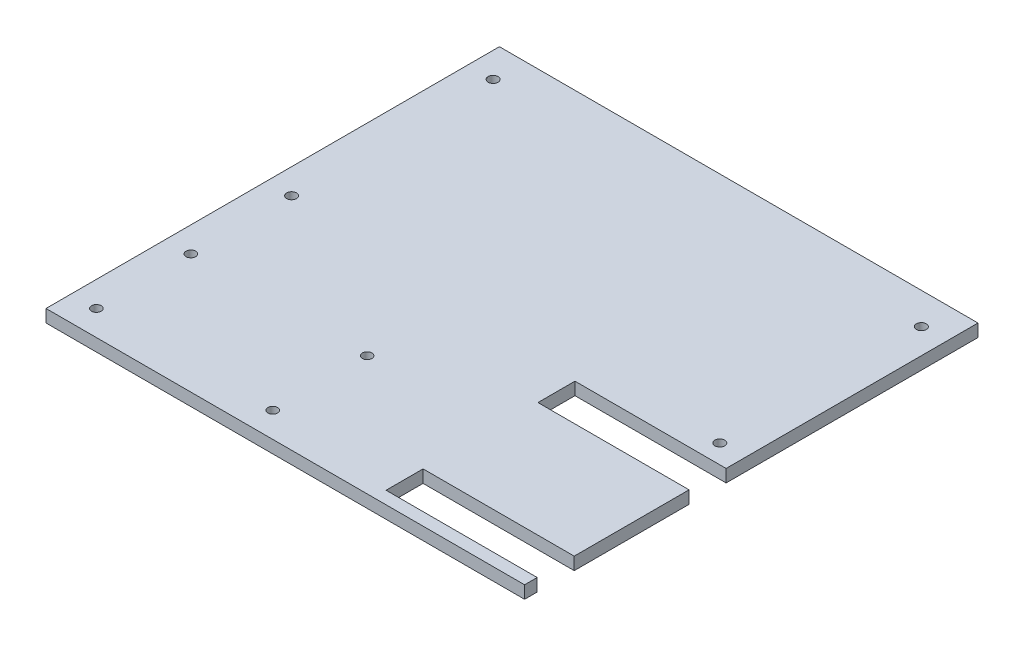
ISO-10303-21;
HEADER;
FILE_DESCRIPTION(('STEP AP214'),'2;1');
FILE_NAME('part.step','',(''),(''),'','','');
FILE_SCHEMA(('AUTOMOTIVE_DESIGN { 1 0 10303 214 1 1 1 1 }'));
ENDSEC;
DATA;
#1=APPLICATION_CONTEXT('core data for automotive mechanical design processes');
#2=APPLICATION_PROTOCOL_DEFINITION('international standard','automotive_design',2000,#1);
#3=PRODUCT_CONTEXT('',#1,'mechanical');
#4=PRODUCT('Part','Part','',(#3));
#5=PRODUCT_RELATED_PRODUCT_CATEGORY('part','',(#4));
#6=PRODUCT_DEFINITION_FORMATION('','',#4);
#7=PRODUCT_DEFINITION_CONTEXT('part definition',#1,'design');
#8=PRODUCT_DEFINITION('design','',#6,#7);
#9=PRODUCT_DEFINITION_SHAPE('','',#8);
#10=(LENGTH_UNIT() NAMED_UNIT(*) SI_UNIT(.MILLI.,.METRE.));
#11=(NAMED_UNIT(*) PLANE_ANGLE_UNIT() SI_UNIT($,.RADIAN.));
#12=(NAMED_UNIT(*) SI_UNIT($,.STERADIAN.) SOLID_ANGLE_UNIT());
#13=UNCERTAINTY_MEASURE_WITH_UNIT(LENGTH_MEASURE(1.E-05),#10,'distance_accuracy_value','');
#14=(GEOMETRIC_REPRESENTATION_CONTEXT(3) GLOBAL_UNCERTAINTY_ASSIGNED_CONTEXT((#13)) GLOBAL_UNIT_ASSIGNED_CONTEXT((#10,
#11,#12)) REPRESENTATION_CONTEXT('',''));
#15=CARTESIAN_POINT('',(0.,0.,0.));
#16=DIRECTION('',(0.,0.,1.));
#17=DIRECTION('',(1.,0.,0.));
#18=AXIS2_PLACEMENT_3D('',#15,#16,#17);
#19=CARTESIAN_POINT('',(0.,6.35,107.95));
#20=DIRECTION('',(0.,0.,-1.));
#21=DIRECTION('',(-1.,0.,0.));
#22=AXIS2_PLACEMENT_3D('',#19,#20,#21);
#23=PLANE('',#22);
#24=DIRECTION('',(1.,0.,0.));
#25=VECTOR('',#24,1.);
#26=CARTESIAN_POINT('',(0.,0.,107.95));
#27=LINE('',#26,#25);
#28=CARTESIAN_POINT('',(44.45,0.,107.95));
#29=VERTEX_POINT('',#28);
#30=CARTESIAN_POINT('',(120.65,0.,107.95));
#31=VERTEX_POINT('',#30);
#32=EDGE_CURVE('E206',#29,#31,#27,.T.);
#33=ORIENTED_EDGE('',*,*,#32,.F.);
#34=DIRECTION('',(0.,-1.,0.));
#35=VECTOR('',#34,1.);
#36=CARTESIAN_POINT('',(44.45,6.35,107.95));
#37=LINE('',#36,#35);
#38=CARTESIAN_POINT('',(44.45,6.35,107.95));
#39=VERTEX_POINT('',#38);
#40=EDGE_CURVE('E11',#39,#29,#37,.T.);
#41=ORIENTED_EDGE('',*,*,#40,.F.);
#42=DIRECTION('',(1.,0.,0.));
#43=VECTOR('',#42,1.);
#44=CARTESIAN_POINT('',(0.,6.35,107.95));
#45=LINE('',#44,#43);
#46=CARTESIAN_POINT('',(120.65,6.35,107.95));
#47=VERTEX_POINT('',#46);
#48=EDGE_CURVE('E257',#39,#47,#45,.T.);
#49=ORIENTED_EDGE('',*,*,#48,.T.);
#50=DIRECTION('',(0.,-1.,0.));
#51=VECTOR('',#50,1.);
#52=CARTESIAN_POINT('',(120.65,6.35,107.95));
#53=LINE('',#52,#51);
#54=EDGE_CURVE('E57',#47,#31,#53,.T.);
#55=ORIENTED_EDGE('',*,*,#54,.T.);
#56=EDGE_LOOP('',(#33,#41,#49,#55));
#57=FACE_BOUND('',#56,.T.);
#58=ADVANCED_FACE('F39',(#57),#23,.T.);
#59=CARTESIAN_POINT('',(44.4499999999999,6.35,0.));
#60=DIRECTION('',(1.,0.,0.));
#61=DIRECTION('',(0.,0.,-1.));
#62=AXIS2_PLACEMENT_3D('',#59,#60,#61);
#63=PLANE('',#62);
#64=DIRECTION('',(0.,0.,1.));
#65=VECTOR('',#64,1.);
#66=CARTESIAN_POINT('',(44.4499999999999,0.,0.));
#67=LINE('',#66,#65);
#68=CARTESIAN_POINT('',(44.45,0.,89.281));
#69=VERTEX_POINT('',#68);
#70=EDGE_CURVE('E198',#69,#29,#67,.T.);
#71=ORIENTED_EDGE('',*,*,#70,.F.);
#72=DIRECTION('',(0.,-1.,0.));
#73=VECTOR('',#72,1.);
#74=CARTESIAN_POINT('',(44.45,6.35,89.281));
#75=LINE('',#74,#73);
#76=CARTESIAN_POINT('',(44.45,6.35,89.281));
#77=VERTEX_POINT('',#76);
#78=EDGE_CURVE('E49',#77,#69,#75,.T.);
#79=ORIENTED_EDGE('',*,*,#78,.F.);
#80=DIRECTION('',(0.,0.,1.));
#81=VECTOR('',#80,1.);
#82=CARTESIAN_POINT('',(44.4499999999999,6.35,0.));
#83=LINE('',#82,#81);
#84=EDGE_CURVE('E255',#77,#39,#83,.T.);
#85=ORIENTED_EDGE('',*,*,#84,.T.);
#86=ORIENTED_EDGE('',*,*,#40,.T.);
#87=EDGE_LOOP('',(#71,#79,#85,#86));
#88=FACE_BOUND('',#87,.T.);
#89=ADVANCED_FACE('F204',(#88),#63,.T.);
#90=CARTESIAN_POINT('',(0.,6.35,89.281));
#91=DIRECTION('',(0.,0.,-1.));
#92=DIRECTION('',(-1.,0.,0.));
#93=AXIS2_PLACEMENT_3D('',#90,#91,#92);
#94=PLANE('',#93);
#95=DIRECTION('',(1.,0.,0.));
#96=VECTOR('',#95,1.);
#97=CARTESIAN_POINT('',(0.,0.,89.281));
#98=LINE('',#97,#96);
#99=CARTESIAN_POINT('',(120.65,0.,89.281));
#100=VERTEX_POINT('',#99);
#101=EDGE_CURVE('E188',#69,#100,#98,.T.);
#102=ORIENTED_EDGE('',*,*,#101,.T.);
#103=DIRECTION('',(0.,-1.,0.));
#104=VECTOR('',#103,1.);
#105=CARTESIAN_POINT('',(120.65,6.35,89.281));
#106=LINE('',#105,#104);
#107=CARTESIAN_POINT('',(120.65,6.35,89.281));
#108=VERTEX_POINT('',#107);
#109=EDGE_CURVE('E179',#108,#100,#106,.T.);
#110=ORIENTED_EDGE('',*,*,#109,.F.);
#111=DIRECTION('',(1.,0.,0.));
#112=VECTOR('',#111,1.);
#113=CARTESIAN_POINT('',(0.,6.35,89.281));
#114=LINE('',#113,#112);
#115=EDGE_CURVE('E190',#77,#108,#114,.T.);
#116=ORIENTED_EDGE('',*,*,#115,.F.);
#117=ORIENTED_EDGE('',*,*,#78,.T.);
#118=EDGE_LOOP('',(#102,#110,#116,#117));
#119=FACE_BOUND('',#118,.T.);
#120=ADVANCED_FACE('F186',(#119),#94,.F.);
#121=CARTESIAN_POINT('',(120.65,6.35,0.));
#122=DIRECTION('',(1.,0.,0.));
#123=DIRECTION('',(0.,0.,-1.));
#124=AXIS2_PLACEMENT_3D('',#121,#122,#123);
#125=PLANE('',#124);
#126=DIRECTION('',(0.,0.,1.));
#127=VECTOR('',#126,1.);
#128=CARTESIAN_POINT('',(120.65,0.,0.));
#129=LINE('',#128,#127);
#130=CARTESIAN_POINT('',(120.65,0.,31.369));
#131=VERTEX_POINT('',#130);
#132=EDGE_CURVE('E201',#131,#100,#129,.T.);
#133=ORIENTED_EDGE('',*,*,#132,.F.);
#134=DIRECTION('',(0.,-1.,0.));
#135=VECTOR('',#134,1.);
#136=CARTESIAN_POINT('',(120.65,6.35,31.369));
#137=LINE('',#136,#135);
#138=CARTESIAN_POINT('',(120.65,6.35,31.369));
#139=VERTEX_POINT('',#138);
#140=EDGE_CURVE('E176',#139,#131,#137,.T.);
#141=ORIENTED_EDGE('',*,*,#140,.F.);
#142=DIRECTION('',(0.,0.,1.));
#143=VECTOR('',#142,1.);
#144=CARTESIAN_POINT('',(120.65,6.35,0.));
#145=LINE('',#144,#143);
#146=EDGE_CURVE('E240',#139,#108,#145,.T.);
#147=ORIENTED_EDGE('',*,*,#146,.T.);
#148=ORIENTED_EDGE('',*,*,#109,.T.);
#149=EDGE_LOOP('',(#133,#141,#147,#148));
#150=FACE_BOUND('',#149,.T.);
#151=ADVANCED_FACE('F317',(#150),#125,.T.);
#152=CARTESIAN_POINT('',(0.,6.35,31.369));
#153=DIRECTION('',(0.,0.,-1.));
#154=DIRECTION('',(-1.,0.,0.));
#155=AXIS2_PLACEMENT_3D('',#152,#153,#154);
#156=PLANE('',#155);
#157=DIRECTION('',(1.,0.,0.));
#158=VECTOR('',#157,1.);
#159=CARTESIAN_POINT('',(0.,0.,31.369));
#160=LINE('',#159,#158);
#161=CARTESIAN_POINT('',(44.45,0.,31.369));
#162=VERTEX_POINT('',#161);
#163=EDGE_CURVE('E215',#162,#131,#160,.T.);
#164=ORIENTED_EDGE('',*,*,#163,.F.);
#165=DIRECTION('',(0.,-1.,0.));
#166=VECTOR('',#165,1.);
#167=CARTESIAN_POINT('',(44.45,6.35,31.369));
#168=LINE('',#167,#166);
#169=CARTESIAN_POINT('',(44.45,6.35,31.369));
#170=VERTEX_POINT('',#169);
#171=EDGE_CURVE('E173',#170,#162,#168,.T.);
#172=ORIENTED_EDGE('',*,*,#171,.F.);
#173=DIRECTION('',(1.,0.,0.));
#174=VECTOR('',#173,1.);
#175=CARTESIAN_POINT('',(0.,6.35,31.369));
#176=LINE('',#175,#174);
#177=EDGE_CURVE('E248',#170,#139,#176,.T.);
#178=ORIENTED_EDGE('',*,*,#177,.T.);
#179=ORIENTED_EDGE('',*,*,#140,.T.);
#180=EDGE_LOOP('',(#164,#172,#178,#179));
#181=FACE_BOUND('',#180,.T.);
#182=ADVANCED_FACE('F315',(#181),#156,.T.);
#183=CARTESIAN_POINT('',(44.45,6.35,0.));
#184=DIRECTION('',(1.,0.,0.));
#185=DIRECTION('',(0.,0.,-1.));
#186=AXIS2_PLACEMENT_3D('',#183,#184,#185);
#187=PLANE('',#186);
#188=DIRECTION('',(0.,0.,1.));
#189=VECTOR('',#188,1.);
#190=CARTESIAN_POINT('',(44.45,0.,0.));
#191=LINE('',#190,#189);
#192=CARTESIAN_POINT('',(44.45,0.,12.7));
#193=VERTEX_POINT('',#192);
#194=EDGE_CURVE('E220',#193,#162,#191,.T.);
#195=ORIENTED_EDGE('',*,*,#194,.F.);
#196=DIRECTION('',(0.,-1.,0.));
#197=VECTOR('',#196,1.);
#198=CARTESIAN_POINT('',(44.45,6.35,12.7));
#199=LINE('',#198,#197);
#200=CARTESIAN_POINT('',(44.45,6.35,12.7));
#201=VERTEX_POINT('',#200);
#202=EDGE_CURVE('E170',#201,#193,#199,.T.);
#203=ORIENTED_EDGE('',*,*,#202,.F.);
#204=DIRECTION('',(0.,0.,1.));
#205=VECTOR('',#204,1.);
#206=CARTESIAN_POINT('',(44.45,6.35,0.));
#207=LINE('',#206,#205);
#208=EDGE_CURVE('E254',#201,#170,#207,.T.);
#209=ORIENTED_EDGE('',*,*,#208,.T.);
#210=ORIENTED_EDGE('',*,*,#171,.T.);
#211=EDGE_LOOP('',(#195,#203,#209,#210));
#212=FACE_BOUND('',#211,.T.);
#213=ADVANCED_FACE('F312',(#212),#187,.T.);
#214=CARTESIAN_POINT('',(0.,6.35,12.7));
#215=DIRECTION('',(0.,0.,-1.));
#216=DIRECTION('',(-1.,0.,0.));
#217=AXIS2_PLACEMENT_3D('',#214,#215,#216);
#218=PLANE('',#217);
#219=DIRECTION('',(1.,0.,0.));
#220=VECTOR('',#219,1.);
#221=CARTESIAN_POINT('',(0.,0.,12.7));
#222=LINE('',#221,#220);
#223=CARTESIAN_POINT('',(120.65,0.,12.7));
#224=VERTEX_POINT('',#223);
#225=EDGE_CURVE('E224',#193,#224,#222,.T.);
#226=ORIENTED_EDGE('',*,*,#225,.T.);
#227=DIRECTION('',(0.,-1.,0.));
#228=VECTOR('',#227,1.);
#229=CARTESIAN_POINT('',(120.65,6.35,12.7));
#230=LINE('',#229,#228);
#231=CARTESIAN_POINT('',(120.65,6.35,12.7));
#232=VERTEX_POINT('',#231);
#233=EDGE_CURVE('E167',#232,#224,#230,.T.);
#234=ORIENTED_EDGE('',*,*,#233,.F.);
#235=DIRECTION('',(1.,0.,0.));
#236=VECTOR('',#235,1.);
#237=CARTESIAN_POINT('',(0.,6.35,12.7));
#238=LINE('',#237,#236);
#239=EDGE_CURVE('E245',#201,#232,#238,.T.);
#240=ORIENTED_EDGE('',*,*,#239,.F.);
#241=ORIENTED_EDGE('',*,*,#202,.T.);
#242=EDGE_LOOP('',(#226,#234,#240,#241));
#243=FACE_BOUND('',#242,.T.);
#244=ADVANCED_FACE('F308',(#243),#218,.F.);
#245=CARTESIAN_POINT('',(120.65,0.,-114.3));
#246=VERTEX_POINT('',#245);
#247=EDGE_CURVE('E217',#246,#224,#129,.T.);
#248=ORIENTED_EDGE('',*,*,#247,.F.);
#249=DIRECTION('',(0.,-1.,0.));
#250=VECTOR('',#249,1.);
#251=CARTESIAN_POINT('',(120.65,6.35,-114.3));
#252=LINE('',#251,#250);
#253=CARTESIAN_POINT('',(120.65,6.35,-114.3));
#254=VERTEX_POINT('',#253);
#255=EDGE_CURVE('E160',#254,#246,#252,.T.);
#256=ORIENTED_EDGE('',*,*,#255,.F.);
#257=EDGE_CURVE('E239',#254,#232,#145,.T.);
#258=ORIENTED_EDGE('',*,*,#257,.T.);
#259=ORIENTED_EDGE('',*,*,#233,.T.);
#260=EDGE_LOOP('',(#248,#256,#258,#259));
#261=FACE_BOUND('',#260,.T.);
#262=ADVANCED_FACE('F304',(#261),#125,.T.);
#263=CARTESIAN_POINT('',(0.,6.35,-114.3));
#264=DIRECTION('',(0.,0.,-1.));
#265=DIRECTION('',(-1.,0.,0.));
#266=AXIS2_PLACEMENT_3D('',#263,#264,#265);
#267=PLANE('',#266);
#268=DIRECTION('',(1.,0.,0.));
#269=VECTOR('',#268,1.);
#270=CARTESIAN_POINT('',(0.,0.,-114.3));
#271=LINE('',#270,#269);
#272=CARTESIAN_POINT('',(-120.65,0.,-114.3));
#273=VERTEX_POINT('',#272);
#274=EDGE_CURVE('E228',#273,#246,#271,.T.);
#275=ORIENTED_EDGE('',*,*,#274,.F.);
#276=DIRECTION('',(0.,-1.,0.));
#277=VECTOR('',#276,1.);
#278=CARTESIAN_POINT('',(-120.65,6.35,-114.3));
#279=LINE('',#278,#277);
#280=CARTESIAN_POINT('',(-120.65,6.35,-114.3));
#281=VERTEX_POINT('',#280);
#282=EDGE_CURVE('E156',#281,#273,#279,.T.);
#283=ORIENTED_EDGE('',*,*,#282,.F.);
#284=DIRECTION('',(1.,0.,0.));
#285=VECTOR('',#284,1.);
#286=CARTESIAN_POINT('',(0.,6.35,-114.3));
#287=LINE('',#286,#285);
#288=EDGE_CURVE('E148',#281,#254,#287,.T.);
#289=ORIENTED_EDGE('',*,*,#288,.T.);
#290=ORIENTED_EDGE('',*,*,#255,.T.);
#291=EDGE_LOOP('',(#275,#283,#289,#290));
#292=FACE_BOUND('',#291,.T.);
#293=ADVANCED_FACE('F330',(#292),#267,.T.);
#294=CARTESIAN_POINT('',(-120.65,6.35,0.));
#295=DIRECTION('',(1.,0.,0.));
#296=DIRECTION('',(0.,0.,-1.));
#297=AXIS2_PLACEMENT_3D('',#294,#295,#296);
#298=PLANE('',#297);
#299=DIRECTION('',(0.,0.,1.));
#300=VECTOR('',#299,1.);
#301=CARTESIAN_POINT('',(-120.65,0.,0.));
#302=LINE('',#301,#300);
#303=CARTESIAN_POINT('',(-120.65,0.,114.3));
#304=VERTEX_POINT('',#303);
#305=EDGE_CURVE('E154',#273,#304,#302,.T.);
#306=ORIENTED_EDGE('',*,*,#305,.T.);
#307=DIRECTION('',(0.,-1.,0.));
#308=VECTOR('',#307,1.);
#309=CARTESIAN_POINT('',(-120.65,6.35,114.3));
#310=LINE('',#309,#308);
#311=CARTESIAN_POINT('',(-120.65,6.35,114.3));
#312=VERTEX_POINT('',#311);
#313=EDGE_CURVE('E135',#312,#304,#310,.T.);
#314=ORIENTED_EDGE('',*,*,#313,.F.);
#315=DIRECTION('',(0.,0.,1.));
#316=VECTOR('',#315,1.);
#317=CARTESIAN_POINT('',(-120.65,6.35,0.));
#318=LINE('',#317,#316);
#319=EDGE_CURVE('E141',#281,#312,#318,.T.);
#320=ORIENTED_EDGE('',*,*,#319,.F.);
#321=ORIENTED_EDGE('',*,*,#282,.T.);
#322=EDGE_LOOP('',(#306,#314,#320,#321));
#323=FACE_BOUND('',#322,.T.);
#324=ADVANCED_FACE('F152',(#323),#298,.F.);
#325=CARTESIAN_POINT('',(0.,6.35,114.3));
#326=DIRECTION('',(0.,0.,-1.));
#327=DIRECTION('',(-1.,0.,0.));
#328=AXIS2_PLACEMENT_3D('',#325,#326,#327);
#329=PLANE('',#328);
#330=DIRECTION('',(1.,0.,0.));
#331=VECTOR('',#330,1.);
#332=CARTESIAN_POINT('',(0.,0.,114.3));
#333=LINE('',#332,#331);
#334=CARTESIAN_POINT('',(120.65,0.,114.3));
#335=VERTEX_POINT('',#334);
#336=EDGE_CURVE('E234',#304,#335,#333,.T.);
#337=ORIENTED_EDGE('',*,*,#336,.T.);
#338=DIRECTION('',(0.,-1.,0.));
#339=VECTOR('',#338,1.);
#340=CARTESIAN_POINT('',(120.65,6.35,114.3));
#341=LINE('',#340,#339);
#342=CARTESIAN_POINT('',(120.65,6.35,114.3));
#343=VERTEX_POINT('',#342);
#344=EDGE_CURVE('E95',#343,#335,#341,.T.);
#345=ORIENTED_EDGE('',*,*,#344,.F.);
#346=DIRECTION('',(1.,0.,0.));
#347=VECTOR('',#346,1.);
#348=CARTESIAN_POINT('',(0.,6.35,114.3));
#349=LINE('',#348,#347);
#350=EDGE_CURVE('E131',#312,#343,#349,.T.);
#351=ORIENTED_EDGE('',*,*,#350,.F.);
#352=ORIENTED_EDGE('',*,*,#313,.T.);
#353=EDGE_LOOP('',(#337,#345,#351,#352));
#354=FACE_BOUND('',#353,.T.);
#355=ADVANCED_FACE('F133',(#354),#329,.F.);
#356=CARTESIAN_POINT('',(-107.95,6.35,101.6));
#357=DIRECTION('',(0.,-1.,0.));
#358=DIRECTION('',(0.,0.,-1.));
#359=AXIS2_PLACEMENT_3D('',#356,#357,#358);
#360=CYLINDRICAL_SURFACE('',#359,2.4257);
#361=CARTESIAN_POINT('',(-107.95,6.35,101.6));
#362=DIRECTION('',(0.,1.,0.));
#363=DIRECTION('',(0.,0.,1.));
#364=AXIS2_PLACEMENT_3D('',#361,#362,#363);
#365=CIRCLE('',#364,2.4257);
#366=CARTESIAN_POINT('',(-107.95,6.35,104.0257));
#367=VERTEX_POINT('',#366);
#368=EDGE_CURVE('E262',#367,#367,#365,.T.);
#369=ORIENTED_EDGE('',*,*,#368,.T.);
#370=EDGE_LOOP('',(#369));
#371=FACE_BOUND('',#370,.T.);
#372=CARTESIAN_POINT('',(-107.95,0.,101.6));
#373=DIRECTION('',(0.,1.,0.));
#374=DIRECTION('',(0.,0.,1.));
#375=AXIS2_PLACEMENT_3D('',#372,#373,#374);
#376=CIRCLE('',#375,2.4257);
#377=CARTESIAN_POINT('',(-107.95,0.,104.0257));
#378=VERTEX_POINT('',#377);
#379=EDGE_CURVE('E209',#378,#378,#376,.T.);
#380=ORIENTED_EDGE('',*,*,#379,.F.);
#381=EDGE_LOOP('',(#380));
#382=FACE_BOUND('',#381,.T.);
#383=ADVANCED_FACE('F339',(#371,#382),#360,.F.);
#384=CARTESIAN_POINT('',(-107.95,6.35,53.975));
#385=DIRECTION('',(0.,-1.,0.));
#386=DIRECTION('',(0.,0.,-1.));
#387=AXIS2_PLACEMENT_3D('',#384,#385,#386);
#388=CYLINDRICAL_SURFACE('',#387,2.4257);
#389=CARTESIAN_POINT('',(-107.95,6.35,53.975));
#390=DIRECTION('',(0.,1.,0.));
#391=DIRECTION('',(0.,0.,1.));
#392=AXIS2_PLACEMENT_3D('',#389,#390,#391);
#393=CIRCLE('',#392,2.4257);
#394=CARTESIAN_POINT('',(-107.95,6.35,56.4007));
#395=VERTEX_POINT('',#394);
#396=EDGE_CURVE('E266',#395,#395,#393,.T.);
#397=ORIENTED_EDGE('',*,*,#396,.T.);
#398=EDGE_LOOP('',(#397));
#399=FACE_BOUND('',#398,.T.);
#400=CARTESIAN_POINT('',(-107.95,0.,53.975));
#401=DIRECTION('',(0.,1.,0.));
#402=DIRECTION('',(0.,0.,1.));
#403=AXIS2_PLACEMENT_3D('',#400,#401,#402);
#404=CIRCLE('',#403,2.4257);
#405=CARTESIAN_POINT('',(-107.95,0.,56.4007));
#406=VERTEX_POINT('',#405);
#407=EDGE_CURVE('E397',#406,#406,#404,.T.);
#408=ORIENTED_EDGE('',*,*,#407,.F.);
#409=EDGE_LOOP('',(#408));
#410=FACE_BOUND('',#409,.T.);
#411=ADVANCED_FACE('F342',(#399,#410),#388,.F.);
#412=CARTESIAN_POINT('',(-19.05,6.35,53.975));
#413=DIRECTION('',(0.,-1.,0.));
#414=DIRECTION('',(0.,0.,-1.));
#415=AXIS2_PLACEMENT_3D('',#412,#413,#414);
#416=CYLINDRICAL_SURFACE('',#415,2.4257);
#417=CARTESIAN_POINT('',(-19.05,6.35,53.975));
#418=DIRECTION('',(0.,1.,0.));
#419=DIRECTION('',(0.,0.,1.));
#420=AXIS2_PLACEMENT_3D('',#417,#418,#419);
#421=CIRCLE('',#420,2.4257);
#422=CARTESIAN_POINT('',(-19.05,6.35,56.4007));
#423=VERTEX_POINT('',#422);
#424=EDGE_CURVE('E270',#423,#423,#421,.T.);
#425=ORIENTED_EDGE('',*,*,#424,.T.);
#426=EDGE_LOOP('',(#425));
#427=FACE_BOUND('',#426,.T.);
#428=CARTESIAN_POINT('',(-19.05,0.,53.975));
#429=DIRECTION('',(0.,1.,0.));
#430=DIRECTION('',(0.,0.,1.));
#431=AXIS2_PLACEMENT_3D('',#428,#429,#430);
#432=CIRCLE('',#431,2.4257);
#433=CARTESIAN_POINT('',(-19.05,0.,56.4007));
#434=VERTEX_POINT('',#433);
#435=EDGE_CURVE('E393',#434,#434,#432,.T.);
#436=ORIENTED_EDGE('',*,*,#435,.F.);
#437=EDGE_LOOP('',(#436));
#438=FACE_BOUND('',#437,.T.);
#439=ADVANCED_FACE('F346',(#427,#438),#416,.F.);
#440=CARTESIAN_POINT('',(-19.05,6.35,101.6));
#441=DIRECTION('',(0.,-1.,0.));
#442=DIRECTION('',(0.,0.,-1.));
#443=AXIS2_PLACEMENT_3D('',#440,#441,#442);
#444=CYLINDRICAL_SURFACE('',#443,2.4257);
#445=CARTESIAN_POINT('',(-19.05,6.35,101.6));
#446=DIRECTION('',(0.,1.,0.));
#447=DIRECTION('',(0.,0.,1.));
#448=AXIS2_PLACEMENT_3D('',#445,#446,#447);
#449=CIRCLE('',#448,2.4257);
#450=CARTESIAN_POINT('',(-19.05,6.35,104.0257));
#451=VERTEX_POINT('',#450);
#452=EDGE_CURVE('E274',#451,#451,#449,.T.);
#453=ORIENTED_EDGE('',*,*,#452,.T.);
#454=EDGE_LOOP('',(#453));
#455=FACE_BOUND('',#454,.T.);
#456=CARTESIAN_POINT('',(-19.05,0.,101.6));
#457=DIRECTION('',(0.,1.,0.));
#458=DIRECTION('',(0.,0.,1.));
#459=AXIS2_PLACEMENT_3D('',#456,#457,#458);
#460=CIRCLE('',#459,2.4257);
#461=CARTESIAN_POINT('',(-19.05,0.,104.0257));
#462=VERTEX_POINT('',#461);
#463=EDGE_CURVE('E389',#462,#462,#460,.T.);
#464=ORIENTED_EDGE('',*,*,#463,.F.);
#465=EDGE_LOOP('',(#464));
#466=FACE_BOUND('',#465,.T.);
#467=ADVANCED_FACE('F350',(#455,#466),#444,.F.);
#468=CARTESIAN_POINT('',(-107.95,6.35,-98.425));
#469=DIRECTION('',(0.,-1.,0.));
#470=DIRECTION('',(0.,0.,-1.));
#471=AXIS2_PLACEMENT_3D('',#468,#469,#470);
#472=CYLINDRICAL_SURFACE('',#471,2.5019);
#473=CARTESIAN_POINT('',(-107.95,6.35,-98.425));
#474=DIRECTION('',(0.,1.,0.));
#475=DIRECTION('',(0.,0.,1.));
#476=AXIS2_PLACEMENT_3D('',#473,#474,#475);
#477=CIRCLE('',#476,2.5019);
#478=CARTESIAN_POINT('',(-107.95,6.35,-95.9231));
#479=VERTEX_POINT('',#478);
#480=EDGE_CURVE('E278',#479,#479,#477,.T.);
#481=ORIENTED_EDGE('',*,*,#480,.T.);
#482=EDGE_LOOP('',(#481));
#483=FACE_BOUND('',#482,.T.);
#484=CARTESIAN_POINT('',(-107.95,0.,-98.425));
#485=DIRECTION('',(0.,1.,0.));
#486=DIRECTION('',(0.,0.,1.));
#487=AXIS2_PLACEMENT_3D('',#484,#485,#486);
#488=CIRCLE('',#487,2.5019);
#489=CARTESIAN_POINT('',(-107.95,0.,-95.9231));
#490=VERTEX_POINT('',#489);
#491=EDGE_CURVE('E381',#490,#490,#488,.T.);
#492=ORIENTED_EDGE('',*,*,#491,.F.);
#493=EDGE_LOOP('',(#492));
#494=FACE_BOUND('',#493,.T.);
#495=ADVANCED_FACE('F354',(#483,#494),#472,.F.);
#496=CARTESIAN_POINT('',(-107.95,6.35,3.175));
#497=DIRECTION('',(0.,-1.,0.));
#498=DIRECTION('',(0.,0.,-1.));
#499=AXIS2_PLACEMENT_3D('',#496,#497,#498);
#500=CYLINDRICAL_SURFACE('',#499,2.5019);
#501=CARTESIAN_POINT('',(-107.95,6.35,3.175));
#502=DIRECTION('',(0.,1.,0.));
#503=DIRECTION('',(0.,0.,1.));
#504=AXIS2_PLACEMENT_3D('',#501,#502,#503);
#505=CIRCLE('',#504,2.5019);
#506=CARTESIAN_POINT('',(-107.95,6.35,5.6769));
#507=VERTEX_POINT('',#506);
#508=EDGE_CURVE('E282',#507,#507,#505,.T.);
#509=ORIENTED_EDGE('',*,*,#508,.T.);
#510=EDGE_LOOP('',(#509));
#511=FACE_BOUND('',#510,.T.);
#512=CARTESIAN_POINT('',(-107.95,0.,3.175));
#513=DIRECTION('',(0.,1.,0.));
#514=DIRECTION('',(0.,0.,1.));
#515=AXIS2_PLACEMENT_3D('',#512,#513,#514);
#516=CIRCLE('',#515,2.5019);
#517=CARTESIAN_POINT('',(-107.95,0.,5.6769));
#518=VERTEX_POINT('',#517);
#519=EDGE_CURVE('E375',#518,#518,#516,.T.);
#520=ORIENTED_EDGE('',*,*,#519,.F.);
#521=EDGE_LOOP('',(#520));
#522=FACE_BOUND('',#521,.T.);
#523=ADVANCED_FACE('F358',(#511,#522),#500,.F.);
#524=CARTESIAN_POINT('',(107.95,6.35,-98.425));
#525=DIRECTION('',(0.,-1.,0.));
#526=DIRECTION('',(0.,0.,-1.));
#527=AXIS2_PLACEMENT_3D('',#524,#525,#526);
#528=CYLINDRICAL_SURFACE('',#527,2.5019);
#529=CARTESIAN_POINT('',(107.95,6.35,-98.425));
#530=DIRECTION('',(0.,1.,0.));
#531=DIRECTION('',(0.,0.,1.));
#532=AXIS2_PLACEMENT_3D('',#529,#530,#531);
#533=CIRCLE('',#532,2.5019);
#534=CARTESIAN_POINT('',(107.95,6.35,-95.9231));
#535=VERTEX_POINT('',#534);
#536=EDGE_CURVE('E286',#535,#535,#533,.T.);
#537=ORIENTED_EDGE('',*,*,#536,.T.);
#538=EDGE_LOOP('',(#537));
#539=FACE_BOUND('',#538,.T.);
#540=CARTESIAN_POINT('',(107.95,0.,-98.425));
#541=DIRECTION('',(0.,1.,0.));
#542=DIRECTION('',(0.,0.,1.));
#543=AXIS2_PLACEMENT_3D('',#540,#541,#542);
#544=CIRCLE('',#543,2.5019);
#545=CARTESIAN_POINT('',(107.95,0.,-95.9231));
#546=VERTEX_POINT('',#545);
#547=EDGE_CURVE('E372',#546,#546,#544,.T.);
#548=ORIENTED_EDGE('',*,*,#547,.F.);
#549=EDGE_LOOP('',(#548));
#550=FACE_BOUND('',#549,.T.);
#551=ADVANCED_FACE('F361',(#539,#550),#528,.F.);
#552=CARTESIAN_POINT('',(107.95,6.35,3.175));
#553=DIRECTION('',(0.,-1.,0.));
#554=DIRECTION('',(0.,0.,-1.));
#555=AXIS2_PLACEMENT_3D('',#552,#553,#554);
#556=CYLINDRICAL_SURFACE('',#555,2.5019);
#557=CARTESIAN_POINT('',(107.95,6.35,3.175));
#558=DIRECTION('',(0.,1.,0.));
#559=DIRECTION('',(0.,0.,1.));
#560=AXIS2_PLACEMENT_3D('',#557,#558,#559);
#561=CIRCLE('',#560,2.5019);
#562=CARTESIAN_POINT('',(107.95,6.35,5.6769));
#563=VERTEX_POINT('',#562);
#564=EDGE_CURVE('E290',#563,#563,#561,.T.);
#565=ORIENTED_EDGE('',*,*,#564,.T.);
#566=EDGE_LOOP('',(#565));
#567=FACE_BOUND('',#566,.T.);
#568=CARTESIAN_POINT('',(107.95,0.,3.175));
#569=DIRECTION('',(0.,1.,0.));
#570=DIRECTION('',(0.,0.,1.));
#571=AXIS2_PLACEMENT_3D('',#568,#569,#570);
#572=CIRCLE('',#571,2.5019);
#573=CARTESIAN_POINT('',(107.95,0.,5.6769));
#574=VERTEX_POINT('',#573);
#575=EDGE_CURVE('E376',#574,#574,#572,.T.);
#576=ORIENTED_EDGE('',*,*,#575,.F.);
#577=EDGE_LOOP('',(#576));
#578=FACE_BOUND('',#577,.T.);
#579=ADVANCED_FACE('F41',(#567,#578),#556,.F.);
#580=EDGE_CURVE('E216',#31,#335,#129,.T.);
#581=ORIENTED_EDGE('',*,*,#580,.F.);
#582=ORIENTED_EDGE('',*,*,#54,.F.);
#583=EDGE_CURVE('E140',#47,#343,#145,.T.);
#584=ORIENTED_EDGE('',*,*,#583,.T.);
#585=ORIENTED_EDGE('',*,*,#344,.T.);
#586=EDGE_LOOP('',(#581,#582,#584,#585));
#587=FACE_BOUND('',#586,.T.);
#588=ADVANCED_FACE('F320',(#587),#125,.T.);
#589=CARTESIAN_POINT('',(0.,6.35,0.));
#590=DIRECTION('',(0.,1.,0.));
#591=DIRECTION('',(0.,0.,1.));
#592=AXIS2_PLACEMENT_3D('',#589,#590,#591);
#593=PLANE('',#592);
#594=ORIENTED_EDGE('',*,*,#564,.F.);
#595=EDGE_LOOP('',(#594));
#596=FACE_BOUND('',#595,.T.);
#597=ORIENTED_EDGE('',*,*,#536,.F.);
#598=EDGE_LOOP('',(#597));
#599=FACE_BOUND('',#598,.T.);
#600=ORIENTED_EDGE('',*,*,#508,.F.);
#601=EDGE_LOOP('',(#600));
#602=FACE_BOUND('',#601,.T.);
#603=ORIENTED_EDGE('',*,*,#480,.F.);
#604=EDGE_LOOP('',(#603));
#605=FACE_BOUND('',#604,.T.);
#606=ORIENTED_EDGE('',*,*,#452,.F.);
#607=EDGE_LOOP('',(#606));
#608=FACE_BOUND('',#607,.T.);
#609=ORIENTED_EDGE('',*,*,#424,.F.);
#610=EDGE_LOOP('',(#609));
#611=FACE_BOUND('',#610,.T.);
#612=ORIENTED_EDGE('',*,*,#396,.F.);
#613=EDGE_LOOP('',(#612));
#614=FACE_BOUND('',#613,.T.);
#615=ORIENTED_EDGE('',*,*,#368,.F.);
#616=EDGE_LOOP('',(#615));
#617=FACE_BOUND('',#616,.T.);
#618=ORIENTED_EDGE('',*,*,#48,.F.);
#619=ORIENTED_EDGE('',*,*,#84,.F.);
#620=ORIENTED_EDGE('',*,*,#115,.T.);
#621=ORIENTED_EDGE('',*,*,#146,.F.);
#622=ORIENTED_EDGE('',*,*,#177,.F.);
#623=ORIENTED_EDGE('',*,*,#208,.F.);
#624=ORIENTED_EDGE('',*,*,#239,.T.);
#625=ORIENTED_EDGE('',*,*,#257,.F.);
#626=ORIENTED_EDGE('',*,*,#288,.F.);
#627=ORIENTED_EDGE('',*,*,#319,.T.);
#628=ORIENTED_EDGE('',*,*,#350,.T.);
#629=ORIENTED_EDGE('',*,*,#583,.F.);
#630=EDGE_LOOP('',(#618,#619,#620,#621,#622,#623,#624,#625,#626,#627,#628,#629));
#631=FACE_BOUND('',#630,.T.);
#632=ADVANCED_FACE('F145',(#596,#599,#602,#605,#608,#611,#614,#617,#631),#593,.T.);
#633=CARTESIAN_POINT('',(0.,0.,0.));
#634=DIRECTION('',(0.,1.,0.));
#635=DIRECTION('',(0.,0.,1.));
#636=AXIS2_PLACEMENT_3D('',#633,#634,#635);
#637=PLANE('',#636);
#638=ORIENTED_EDGE('',*,*,#575,.T.);
#639=EDGE_LOOP('',(#638));
#640=FACE_BOUND('',#639,.T.);
#641=ORIENTED_EDGE('',*,*,#547,.T.);
#642=EDGE_LOOP('',(#641));
#643=FACE_BOUND('',#642,.T.);
#644=ORIENTED_EDGE('',*,*,#519,.T.);
#645=EDGE_LOOP('',(#644));
#646=FACE_BOUND('',#645,.T.);
#647=ORIENTED_EDGE('',*,*,#491,.T.);
#648=EDGE_LOOP('',(#647));
#649=FACE_BOUND('',#648,.T.);
#650=ORIENTED_EDGE('',*,*,#463,.T.);
#651=EDGE_LOOP('',(#650));
#652=FACE_BOUND('',#651,.T.);
#653=ORIENTED_EDGE('',*,*,#435,.T.);
#654=EDGE_LOOP('',(#653));
#655=FACE_BOUND('',#654,.T.);
#656=ORIENTED_EDGE('',*,*,#407,.T.);
#657=EDGE_LOOP('',(#656));
#658=FACE_BOUND('',#657,.T.);
#659=ORIENTED_EDGE('',*,*,#379,.T.);
#660=EDGE_LOOP('',(#659));
#661=FACE_BOUND('',#660,.T.);
#662=ORIENTED_EDGE('',*,*,#32,.T.);
#663=ORIENTED_EDGE('',*,*,#580,.T.);
#664=ORIENTED_EDGE('',*,*,#336,.F.);
#665=ORIENTED_EDGE('',*,*,#305,.F.);
#666=ORIENTED_EDGE('',*,*,#274,.T.);
#667=ORIENTED_EDGE('',*,*,#247,.T.);
#668=ORIENTED_EDGE('',*,*,#225,.F.);
#669=ORIENTED_EDGE('',*,*,#194,.T.);
#670=ORIENTED_EDGE('',*,*,#163,.T.);
#671=ORIENTED_EDGE('',*,*,#132,.T.);
#672=ORIENTED_EDGE('',*,*,#101,.F.);
#673=ORIENTED_EDGE('',*,*,#70,.T.);
#674=EDGE_LOOP('',(#662,#663,#664,#665,#666,#667,#668,#669,#670,#671,#672,#673));
#675=FACE_BOUND('',#674,.T.);
#676=ADVANCED_FACE('F197',(#640,#643,#646,#649,#652,#655,#658,#661,#675),#637,.F.);
#677=CLOSED_SHELL('',(#58,#89,#120,#151,#182,#213,#244,#262,#293,#324,#355,#383,#411,#439,#467,
#495,#523,#551,#579,#588,#632,#676));
#678=MANIFOLD_SOLID_BREP('B2',#677);
#679=ADVANCED_BREP_SHAPE_REPRESENTATION('',(#18,#678),#14);
#680=SHAPE_DEFINITION_REPRESENTATION(#9,#679);
ENDSEC;
END-ISO-10303-21;
